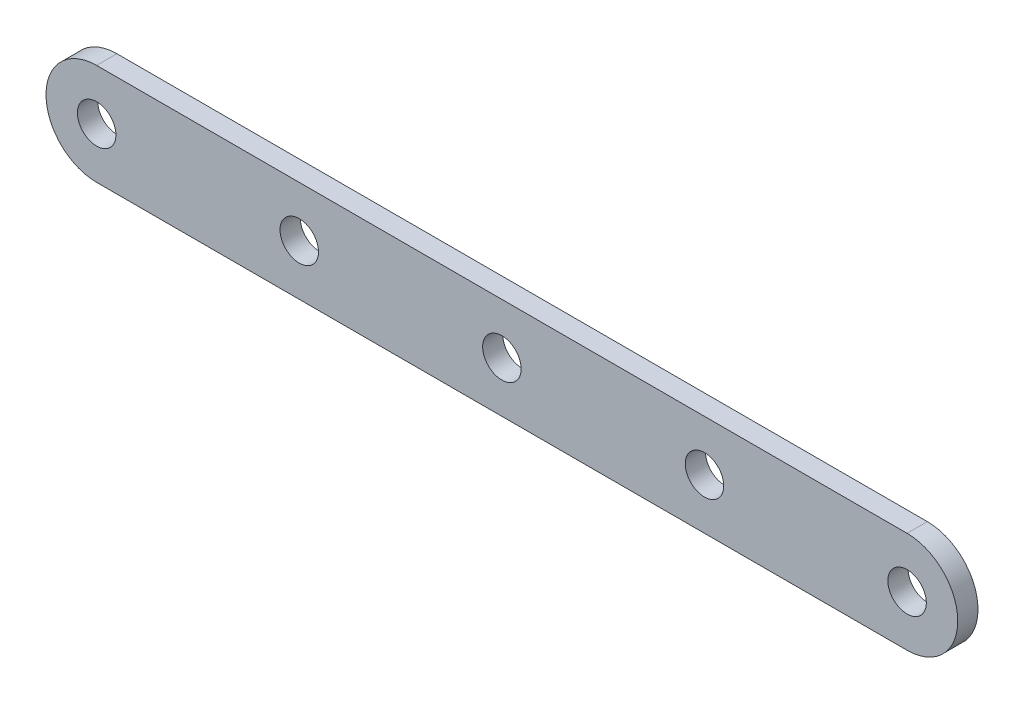
ISO-10303-21;
HEADER;
FILE_DESCRIPTION(('STEP AP214'),'2;1');
FILE_NAME('part.step','',(''),(''),'','','');
FILE_SCHEMA(('AUTOMOTIVE_DESIGN { 1 0 10303 214 1 1 1 1 }'));
ENDSEC;
DATA;
#1=APPLICATION_CONTEXT('core data for automotive mechanical design processes');
#2=APPLICATION_PROTOCOL_DEFINITION('international standard','automotive_design',2000,#1);
#3=PRODUCT_CONTEXT('',#1,'mechanical');
#4=PRODUCT('Part','Part','',(#3));
#5=PRODUCT_RELATED_PRODUCT_CATEGORY('part','',(#4));
#6=PRODUCT_DEFINITION_FORMATION('','',#4);
#7=PRODUCT_DEFINITION_CONTEXT('part definition',#1,'design');
#8=PRODUCT_DEFINITION('design','',#6,#7);
#9=PRODUCT_DEFINITION_SHAPE('','',#8);
#10=(LENGTH_UNIT() NAMED_UNIT(*) SI_UNIT(.MILLI.,.METRE.));
#11=(NAMED_UNIT(*) PLANE_ANGLE_UNIT() SI_UNIT($,.RADIAN.));
#12=(NAMED_UNIT(*) SI_UNIT($,.STERADIAN.) SOLID_ANGLE_UNIT());
#13=UNCERTAINTY_MEASURE_WITH_UNIT(LENGTH_MEASURE(1.E-05),#10,'distance_accuracy_value','');
#14=(GEOMETRIC_REPRESENTATION_CONTEXT(3) GLOBAL_UNCERTAINTY_ASSIGNED_CONTEXT((#13)) GLOBAL_UNIT_ASSIGNED_CONTEXT((#10,
#11,#12)) REPRESENTATION_CONTEXT('',''));
#15=CARTESIAN_POINT('',(0.,0.,0.));
#16=DIRECTION('',(0.,0.,1.));
#17=DIRECTION('',(1.,0.,0.));
#18=AXIS2_PLACEMENT_3D('',#15,#16,#17);
#19=CARTESIAN_POINT('',(-50.8,0.,1.27000000000002));
#20=DIRECTION('',(0.,0.,-1.));
#21=DIRECTION('',(-1.,0.,0.));
#22=AXIS2_PLACEMENT_3D('',#19,#20,#21);
#23=CYLINDRICAL_SURFACE('',#22,6.35);
#24=CARTESIAN_POINT('',(-50.8,0.,-1.27));
#25=DIRECTION('',(0.,0.,1.));
#26=DIRECTION('',(1.,0.,0.));
#27=AXIS2_PLACEMENT_3D('',#24,#25,#26);
#28=CIRCLE('',#27,6.35);
#29=CARTESIAN_POINT('',(-50.8,6.35,-1.27));
#30=VERTEX_POINT('',#29);
#31=CARTESIAN_POINT('',(-50.8,-6.35000000000001,-1.27));
#32=VERTEX_POINT('',#31);
#33=EDGE_CURVE('E97',#30,#32,#28,.T.);
#34=ORIENTED_EDGE('',*,*,#33,.T.);
#35=DIRECTION('',(0.,0.,-1.));
#36=VECTOR('',#35,1.);
#37=CARTESIAN_POINT('',(-50.8,-6.35000000000001,1.27));
#38=LINE('',#37,#36);
#39=CARTESIAN_POINT('',(-50.8,-6.35000000000001,1.27));
#40=VERTEX_POINT('',#39);
#41=EDGE_CURVE('E11',#40,#32,#38,.T.);
#42=ORIENTED_EDGE('',*,*,#41,.F.);
#43=CARTESIAN_POINT('',(-50.8,0.,1.27000000000002));
#44=DIRECTION('',(0.,0.,1.));
#45=DIRECTION('',(1.,0.,0.));
#46=AXIS2_PLACEMENT_3D('',#43,#44,#45);
#47=CIRCLE('',#46,6.35);
#48=CARTESIAN_POINT('',(-50.8,6.35,1.26999999999998));
#49=VERTEX_POINT('',#48);
#50=EDGE_CURVE('E85',#49,#40,#47,.T.);
#51=ORIENTED_EDGE('',*,*,#50,.F.);
#52=DIRECTION('',(0.,0.,-1.));
#53=VECTOR('',#52,1.);
#54=CARTESIAN_POINT('',(-50.8,6.35,1.26999999999998));
#55=LINE('',#54,#53);
#56=EDGE_CURVE('E93',#49,#30,#55,.T.);
#57=ORIENTED_EDGE('',*,*,#56,.T.);
#58=EDGE_LOOP('',(#34,#42,#51,#57));
#59=FACE_BOUND('',#58,.T.);
#60=ADVANCED_FACE('F34',(#59),#23,.T.);
#61=CARTESIAN_POINT('',(-50.8,-6.35000000000001,1.27));
#62=DIRECTION('',(0.,1.,0.));
#63=DIRECTION('',(0.,0.,1.));
#64=AXIS2_PLACEMENT_3D('',#61,#62,#63);
#65=PLANE('',#64);
#66=DIRECTION('',(1.,0.,0.));
#67=VECTOR('',#66,1.);
#68=CARTESIAN_POINT('',(-50.8,-6.35000000000001,-1.27));
#69=LINE('',#68,#67);
#70=CARTESIAN_POINT('',(50.8000000000001,-6.35000000000001,-1.26999999999996));
#71=VERTEX_POINT('',#70);
#72=EDGE_CURVE('E89',#32,#71,#69,.T.);
#73=ORIENTED_EDGE('',*,*,#72,.T.);
#74=DIRECTION('',(0.,0.,-1.));
#75=VECTOR('',#74,1.);
#76=CARTESIAN_POINT('',(50.8000000000001,-6.35000000000001,1.27000000000002));
#77=LINE('',#76,#75);
#78=CARTESIAN_POINT('',(50.8000000000001,-6.35000000000001,1.27000000000002));
#79=VERTEX_POINT('',#78);
#80=EDGE_CURVE('E42',#79,#71,#77,.T.);
#81=ORIENTED_EDGE('',*,*,#80,.F.);
#82=DIRECTION('',(1.,0.,0.));
#83=VECTOR('',#82,1.);
#84=CARTESIAN_POINT('',(-50.8,-6.35000000000001,1.27));
#85=LINE('',#84,#83);
#86=EDGE_CURVE('E80',#40,#79,#85,.T.);
#87=ORIENTED_EDGE('',*,*,#86,.F.);
#88=ORIENTED_EDGE('',*,*,#41,.T.);
#89=EDGE_LOOP('',(#73,#81,#87,#88));
#90=FACE_BOUND('',#89,.T.);
#91=ADVANCED_FACE('F88',(#90),#65,.F.);
#92=CARTESIAN_POINT('',(50.8,0.,1.26999999999998));
#93=DIRECTION('',(0.,0.,-1.));
#94=DIRECTION('',(-1.,0.,0.));
#95=AXIS2_PLACEMENT_3D('',#92,#93,#94);
#96=CYLINDRICAL_SURFACE('',#95,6.35);
#97=CARTESIAN_POINT('',(50.8,0.,-1.26999999999996));
#98=DIRECTION('',(0.,0.,1.));
#99=DIRECTION('',(-1.,0.,0.));
#100=AXIS2_PLACEMENT_3D('',#97,#98,#99);
#101=CIRCLE('',#100,6.35);
#102=CARTESIAN_POINT('',(50.8,6.35000000000001,-1.26999999999999));
#103=VERTEX_POINT('',#102);
#104=EDGE_CURVE('E67',#71,#103,#101,.T.);
#105=ORIENTED_EDGE('',*,*,#104,.T.);
#106=DIRECTION('',(0.,0.,-1.));
#107=VECTOR('',#106,1.);
#108=CARTESIAN_POINT('',(50.8,6.35000000000001,1.27));
#109=LINE('',#108,#107);
#110=CARTESIAN_POINT('',(50.8,6.35000000000001,1.27));
#111=VERTEX_POINT('',#110);
#112=EDGE_CURVE('E90',#111,#103,#109,.T.);
#113=ORIENTED_EDGE('',*,*,#112,.F.);
#114=CARTESIAN_POINT('',(50.8,0.,1.26999999999998));
#115=DIRECTION('',(0.,0.,1.));
#116=DIRECTION('',(-1.,0.,0.));
#117=AXIS2_PLACEMENT_3D('',#114,#115,#116);
#118=CIRCLE('',#117,6.35);
#119=EDGE_CURVE('E83',#79,#111,#118,.T.);
#120=ORIENTED_EDGE('',*,*,#119,.F.);
#121=ORIENTED_EDGE('',*,*,#80,.T.);
#122=EDGE_LOOP('',(#105,#113,#120,#121));
#123=FACE_BOUND('',#122,.T.);
#124=ADVANCED_FACE('F91',(#123),#96,.T.);
#125=CARTESIAN_POINT('',(-50.8,6.35,1.26999999999998));
#126=DIRECTION('',(0.,-1.,0.));
#127=DIRECTION('',(0.,0.,-1.));
#128=AXIS2_PLACEMENT_3D('',#125,#126,#127);
#129=PLANE('',#128);
#130=DIRECTION('',(-1.,0.,0.));
#131=VECTOR('',#130,1.);
#132=CARTESIAN_POINT('',(-50.8,6.35,-1.27));
#133=LINE('',#132,#131);
#134=EDGE_CURVE('E73',#103,#30,#133,.T.);
#135=ORIENTED_EDGE('',*,*,#134,.T.);
#136=ORIENTED_EDGE('',*,*,#56,.F.);
#137=DIRECTION('',(-1.,0.,0.));
#138=VECTOR('',#137,1.);
#139=CARTESIAN_POINT('',(-50.8,6.35,1.26999999999998));
#140=LINE('',#139,#138);
#141=EDGE_CURVE('E50',#111,#49,#140,.T.);
#142=ORIENTED_EDGE('',*,*,#141,.F.);
#143=ORIENTED_EDGE('',*,*,#112,.T.);
#144=EDGE_LOOP('',(#135,#136,#142,#143));
#145=FACE_BOUND('',#144,.T.);
#146=ADVANCED_FACE('F105',(#145),#129,.F.);
#147=CARTESIAN_POINT('',(-50.8,0.,1.27000000000002));
#148=DIRECTION('',(0.,0.,1.));
#149=DIRECTION('',(1.,0.,0.));
#150=AXIS2_PLACEMENT_3D('',#147,#148,#149);
#151=PLANE('',#150);
#152=CARTESIAN_POINT('',(50.8000000000001,0.,1.26999999999998));
#153=DIRECTION('',(0.,0.,1.));
#154=DIRECTION('',(1.,0.,0.));
#155=AXIS2_PLACEMENT_3D('',#152,#153,#154);
#156=CIRCLE('',#155,2.413);
#157=CARTESIAN_POINT('',(53.2130000000001,0.,1.26999999999998));
#158=VERTEX_POINT('',#157);
#159=EDGE_CURVE('E135',#158,#158,#156,.T.);
#160=ORIENTED_EDGE('',*,*,#159,.F.);
#161=EDGE_LOOP('',(#160));
#162=FACE_BOUND('',#161,.T.);
#163=CARTESIAN_POINT('',(25.4000000000001,0.,1.27000000000002));
#164=DIRECTION('',(0.,0.,1.));
#165=DIRECTION('',(1.,0.,0.));
#166=AXIS2_PLACEMENT_3D('',#163,#164,#165);
#167=CIRCLE('',#166,2.413);
#168=CARTESIAN_POINT('',(27.8130000000001,0.,1.27000000000002));
#169=VERTEX_POINT('',#168);
#170=EDGE_CURVE('E129',#169,#169,#167,.T.);
#171=ORIENTED_EDGE('',*,*,#170,.F.);
#172=EDGE_LOOP('',(#171));
#173=FACE_BOUND('',#172,.T.);
#174=CARTESIAN_POINT('',(0.,0.,1.27));
#175=DIRECTION('',(0.,0.,1.));
#176=DIRECTION('',(1.,0.,0.));
#177=AXIS2_PLACEMENT_3D('',#174,#175,#176);
#178=CIRCLE('',#177,2.413);
#179=CARTESIAN_POINT('',(2.413,0.,1.27));
#180=VERTEX_POINT('',#179);
#181=EDGE_CURVE('E123',#180,#180,#178,.T.);
#182=ORIENTED_EDGE('',*,*,#181,.F.);
#183=EDGE_LOOP('',(#182));
#184=FACE_BOUND('',#183,.T.);
#185=CARTESIAN_POINT('',(-25.4,0.,1.27));
#186=DIRECTION('',(0.,0.,1.));
#187=DIRECTION('',(1.,0.,0.));
#188=AXIS2_PLACEMENT_3D('',#185,#186,#187);
#189=CIRCLE('',#188,2.413);
#190=CARTESIAN_POINT('',(-22.987,0.,1.27));
#191=VERTEX_POINT('',#190);
#192=EDGE_CURVE('E117',#191,#191,#189,.T.);
#193=ORIENTED_EDGE('',*,*,#192,.F.);
#194=EDGE_LOOP('',(#193));
#195=FACE_BOUND('',#194,.T.);
#196=CARTESIAN_POINT('',(-50.8,0.,1.27000000000002));
#197=DIRECTION('',(0.,0.,1.));
#198=DIRECTION('',(1.,0.,0.));
#199=AXIS2_PLACEMENT_3D('',#196,#197,#198);
#200=CIRCLE('',#199,2.413);
#201=CARTESIAN_POINT('',(-48.3870000000001,0.,1.27000000000002));
#202=VERTEX_POINT('',#201);
#203=EDGE_CURVE('E111',#202,#202,#200,.T.);
#204=ORIENTED_EDGE('',*,*,#203,.F.);
#205=EDGE_LOOP('',(#204));
#206=FACE_BOUND('',#205,.T.);
#207=ORIENTED_EDGE('',*,*,#50,.T.);
#208=ORIENTED_EDGE('',*,*,#86,.T.);
#209=ORIENTED_EDGE('',*,*,#119,.T.);
#210=ORIENTED_EDGE('',*,*,#141,.T.);
#211=EDGE_LOOP('',(#207,#208,#209,#210));
#212=FACE_BOUND('',#211,.T.);
#213=ADVANCED_FACE('F81',(#162,#173,#184,#195,#206,#212),#151,.T.);
#214=CARTESIAN_POINT('',(-50.8,0.,-1.27));
#215=DIRECTION('',(0.,0.,1.));
#216=DIRECTION('',(1.,0.,0.));
#217=AXIS2_PLACEMENT_3D('',#214,#215,#216);
#218=PLANE('',#217);
#219=CARTESIAN_POINT('',(50.8000000000001,0.,-1.26999999999996));
#220=DIRECTION('',(0.,0.,1.));
#221=DIRECTION('',(1.,0.,0.));
#222=AXIS2_PLACEMENT_3D('',#219,#220,#221);
#223=CIRCLE('',#222,2.413);
#224=CARTESIAN_POINT('',(53.2130000000001,0.,-1.26999999999996));
#225=VERTEX_POINT('',#224);
#226=EDGE_CURVE('E132',#225,#225,#223,.T.);
#227=ORIENTED_EDGE('',*,*,#226,.T.);
#228=EDGE_LOOP('',(#227));
#229=FACE_BOUND('',#228,.T.);
#230=CARTESIAN_POINT('',(25.4000000000001,0.,-1.27));
#231=DIRECTION('',(0.,0.,1.));
#232=DIRECTION('',(1.,0.,0.));
#233=AXIS2_PLACEMENT_3D('',#230,#231,#232);
#234=CIRCLE('',#233,2.413);
#235=CARTESIAN_POINT('',(27.8130000000001,0.,-1.27));
#236=VERTEX_POINT('',#235);
#237=EDGE_CURVE('E126',#236,#236,#234,.T.);
#238=ORIENTED_EDGE('',*,*,#237,.T.);
#239=EDGE_LOOP('',(#238));
#240=FACE_BOUND('',#239,.T.);
#241=CARTESIAN_POINT('',(0.,0.,-1.27));
#242=DIRECTION('',(0.,0.,1.));
#243=DIRECTION('',(1.,0.,0.));
#244=AXIS2_PLACEMENT_3D('',#241,#242,#243);
#245=CIRCLE('',#244,2.413);
#246=CARTESIAN_POINT('',(2.413,0.,-1.27));
#247=VERTEX_POINT('',#246);
#248=EDGE_CURVE('E120',#247,#247,#245,.T.);
#249=ORIENTED_EDGE('',*,*,#248,.T.);
#250=EDGE_LOOP('',(#249));
#251=FACE_BOUND('',#250,.T.);
#252=CARTESIAN_POINT('',(-25.4,0.,-1.27));
#253=DIRECTION('',(0.,0.,1.));
#254=DIRECTION('',(1.,0.,0.));
#255=AXIS2_PLACEMENT_3D('',#252,#253,#254);
#256=CIRCLE('',#255,2.413);
#257=CARTESIAN_POINT('',(-22.987,0.,-1.27));
#258=VERTEX_POINT('',#257);
#259=EDGE_CURVE('E114',#258,#258,#256,.T.);
#260=ORIENTED_EDGE('',*,*,#259,.T.);
#261=EDGE_LOOP('',(#260));
#262=FACE_BOUND('',#261,.T.);
#263=CARTESIAN_POINT('',(-50.8,0.,-1.27));
#264=DIRECTION('',(0.,0.,1.));
#265=DIRECTION('',(1.,0.,0.));
#266=AXIS2_PLACEMENT_3D('',#263,#264,#265);
#267=CIRCLE('',#266,2.413);
#268=CARTESIAN_POINT('',(-48.3870000000001,0.,-1.27));
#269=VERTEX_POINT('',#268);
#270=EDGE_CURVE('E100',#269,#269,#267,.T.);
#271=ORIENTED_EDGE('',*,*,#270,.T.);
#272=EDGE_LOOP('',(#271));
#273=FACE_BOUND('',#272,.T.);
#274=ORIENTED_EDGE('',*,*,#33,.F.);
#275=ORIENTED_EDGE('',*,*,#134,.F.);
#276=ORIENTED_EDGE('',*,*,#104,.F.);
#277=ORIENTED_EDGE('',*,*,#72,.F.);
#278=EDGE_LOOP('',(#274,#275,#276,#277));
#279=FACE_BOUND('',#278,.T.);
#280=ADVANCED_FACE('F108',(#229,#240,#251,#262,#273,#279),#218,.F.);
#281=CARTESIAN_POINT('',(-50.8,0.,-1.27));
#282=DIRECTION('',(0.,0.,1.));
#283=DIRECTION('',(1.,0.,0.));
#284=AXIS2_PLACEMENT_3D('',#281,#282,#283);
#285=CYLINDRICAL_SURFACE('',#284,2.413);
#286=ORIENTED_EDGE('',*,*,#270,.F.);
#287=EDGE_LOOP('',(#286));
#288=FACE_BOUND('',#287,.T.);
#289=ORIENTED_EDGE('',*,*,#203,.T.);
#290=EDGE_LOOP('',(#289));
#291=FACE_BOUND('',#290,.T.);
#292=ADVANCED_FACE('F161',(#288,#291),#285,.F.);
#293=CARTESIAN_POINT('',(-25.4,0.,-1.27));
#294=DIRECTION('',(0.,0.,1.));
#295=DIRECTION('',(1.,0.,0.));
#296=AXIS2_PLACEMENT_3D('',#293,#294,#295);
#297=CYLINDRICAL_SURFACE('',#296,2.413);
#298=ORIENTED_EDGE('',*,*,#259,.F.);
#299=EDGE_LOOP('',(#298));
#300=FACE_BOUND('',#299,.T.);
#301=ORIENTED_EDGE('',*,*,#192,.T.);
#302=EDGE_LOOP('',(#301));
#303=FACE_BOUND('',#302,.T.);
#304=ADVANCED_FACE('F163',(#300,#303),#297,.F.);
#305=CARTESIAN_POINT('',(0.,0.,-1.27));
#306=DIRECTION('',(0.,0.,1.));
#307=DIRECTION('',(1.,0.,0.));
#308=AXIS2_PLACEMENT_3D('',#305,#306,#307);
#309=CYLINDRICAL_SURFACE('',#308,2.413);
#310=ORIENTED_EDGE('',*,*,#248,.F.);
#311=EDGE_LOOP('',(#310));
#312=FACE_BOUND('',#311,.T.);
#313=ORIENTED_EDGE('',*,*,#181,.T.);
#314=EDGE_LOOP('',(#313));
#315=FACE_BOUND('',#314,.T.);
#316=ADVANCED_FACE('F170',(#312,#315),#309,.F.);
#317=CARTESIAN_POINT('',(25.4000000000001,0.,-1.27));
#318=DIRECTION('',(0.,0.,1.));
#319=DIRECTION('',(1.,0.,0.));
#320=AXIS2_PLACEMENT_3D('',#317,#318,#319);
#321=CYLINDRICAL_SURFACE('',#320,2.413);
#322=ORIENTED_EDGE('',*,*,#237,.F.);
#323=EDGE_LOOP('',(#322));
#324=FACE_BOUND('',#323,.T.);
#325=ORIENTED_EDGE('',*,*,#170,.T.);
#326=EDGE_LOOP('',(#325));
#327=FACE_BOUND('',#326,.T.);
#328=ADVANCED_FACE('F146',(#324,#327),#321,.F.);
#329=CARTESIAN_POINT('',(50.8000000000001,0.,-1.26999999999996));
#330=DIRECTION('',(0.,0.,1.));
#331=DIRECTION('',(1.,0.,0.));
#332=AXIS2_PLACEMENT_3D('',#329,#330,#331);
#333=CYLINDRICAL_SURFACE('',#332,2.413);
#334=ORIENTED_EDGE('',*,*,#226,.F.);
#335=EDGE_LOOP('',(#334));
#336=FACE_BOUND('',#335,.T.);
#337=ORIENTED_EDGE('',*,*,#159,.T.);
#338=EDGE_LOOP('',(#337));
#339=FACE_BOUND('',#338,.T.);
#340=ADVANCED_FACE('F143',(#336,#339),#333,.F.);
#341=CLOSED_SHELL('',(#60,#91,#124,#146,#213,#280,#292,#304,#316,#328,#340));
#342=MANIFOLD_SOLID_BREP('B2',#341);
#343=ADVANCED_BREP_SHAPE_REPRESENTATION('',(#18,#342),#14);
#344=SHAPE_DEFINITION_REPRESENTATION(#9,#343);
ENDSEC;
END-ISO-10303-21;
